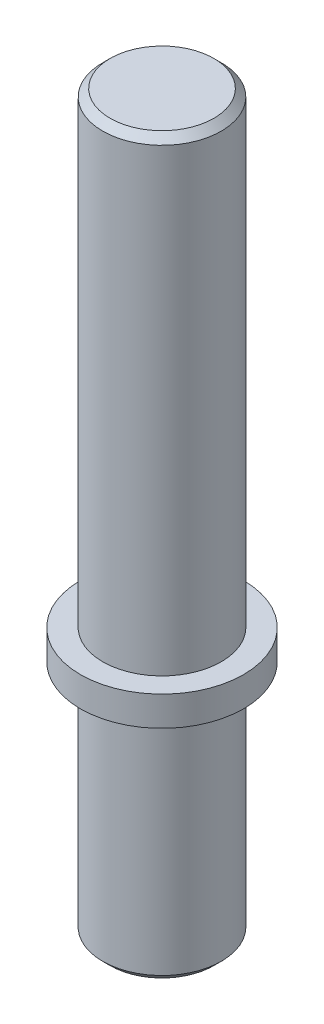
ISO-10303-21;
HEADER;
FILE_DESCRIPTION(('STEP AP214'),'2;1');
FILE_NAME('part.step','',(''),(''),'','','');
FILE_SCHEMA(('AUTOMOTIVE_DESIGN { 1 0 10303 214 1 1 1 1 }'));
ENDSEC;
DATA;
#1=APPLICATION_CONTEXT('core data for automotive mechanical design processes');
#2=APPLICATION_PROTOCOL_DEFINITION('international standard','automotive_design',2000,#1);
#3=PRODUCT_CONTEXT('',#1,'mechanical');
#4=PRODUCT('Part','Part','',(#3));
#5=PRODUCT_RELATED_PRODUCT_CATEGORY('part','',(#4));
#6=PRODUCT_DEFINITION_FORMATION('','',#4);
#7=PRODUCT_DEFINITION_CONTEXT('part definition',#1,'design');
#8=PRODUCT_DEFINITION('design','',#6,#7);
#9=PRODUCT_DEFINITION_SHAPE('','',#8);
#10=(LENGTH_UNIT() NAMED_UNIT(*) SI_UNIT(.MILLI.,.METRE.));
#11=(NAMED_UNIT(*) PLANE_ANGLE_UNIT() SI_UNIT($,.RADIAN.));
#12=(NAMED_UNIT(*) SI_UNIT($,.STERADIAN.) SOLID_ANGLE_UNIT());
#13=UNCERTAINTY_MEASURE_WITH_UNIT(LENGTH_MEASURE(1.E-05),#10,'distance_accuracy_value','');
#14=(GEOMETRIC_REPRESENTATION_CONTEXT(3) GLOBAL_UNCERTAINTY_ASSIGNED_CONTEXT((#13)) GLOBAL_UNIT_ASSIGNED_CONTEXT((#10,
#11,#12)) REPRESENTATION_CONTEXT('',''));
#15=CARTESIAN_POINT('',(0.,0.,0.));
#16=DIRECTION('',(0.,0.,1.));
#17=DIRECTION('',(1.,0.,0.));
#18=AXIS2_PLACEMENT_3D('',#15,#16,#17);
#19=CARTESIAN_POINT('',(0.,16.,0.));
#20=DIRECTION('',(0.,-1.,0.));
#21=DIRECTION('',(0.,0.,-1.));
#22=AXIS2_PLACEMENT_3D('',#19,#20,#21);
#23=CYLINDRICAL_SURFACE('',#22,4.);
#24=CARTESIAN_POINT('',(0.,0.49999999999999,0.));
#25=DIRECTION('',(0.,1.,0.));
#26=DIRECTION('',(0.,0.,1.));
#27=AXIS2_PLACEMENT_3D('',#24,#25,#26);
#28=CIRCLE('',#27,4.);
#29=CARTESIAN_POINT('',(0.,0.49999999999999,4.));
#30=VERTEX_POINT('',#29);
#31=EDGE_CURVE('E53',#30,#30,#28,.T.);
#32=ORIENTED_EDGE('',*,*,#31,.T.);
#33=EDGE_LOOP('',(#32));
#34=FACE_BOUND('',#33,.T.);
#35=CARTESIAN_POINT('',(0.,16.,0.));
#36=DIRECTION('',(0.,1.,0.));
#37=DIRECTION('',(0.,0.,1.));
#38=AXIS2_PLACEMENT_3D('',#35,#36,#37);
#39=CIRCLE('',#38,4.);
#40=CARTESIAN_POINT('',(0.,16.,4.));
#41=VERTEX_POINT('',#40);
#42=EDGE_CURVE('E59',#41,#41,#39,.T.);
#43=ORIENTED_EDGE('',*,*,#42,.F.);
#44=EDGE_LOOP('',(#43));
#45=FACE_BOUND('',#44,.T.);
#46=ADVANCED_FACE('F37',(#34,#45),#23,.T.);
#47=CARTESIAN_POINT('',(0.,0.,0.));
#48=DIRECTION('',(0.,1.,0.));
#49=DIRECTION('',(0.,0.,1.));
#50=AXIS2_PLACEMENT_3D('',#47,#48,#49);
#51=PLANE('',#50);
#52=CARTESIAN_POINT('',(0.,0.,0.));
#53=DIRECTION('',(0.,1.,0.));
#54=DIRECTION('',(0.,0.,1.));
#55=AXIS2_PLACEMENT_3D('',#52,#53,#54);
#56=CIRCLE('',#55,3.50000000000001);
#57=CARTESIAN_POINT('',(0.,0.,3.50000000000001));
#58=VERTEX_POINT('',#57);
#59=EDGE_CURVE('E49',#58,#58,#56,.F.);
#60=ORIENTED_EDGE('',*,*,#59,.T.);
#61=EDGE_LOOP('',(#60));
#62=FACE_BOUND('',#61,.T.);
#63=ADVANCED_FACE('F83',(#62),#51,.F.);
#64=CARTESIAN_POINT('',(0.,18.,0.));
#65=DIRECTION('',(0.,-1.,0.));
#66=DIRECTION('',(0.,0.,-1.));
#67=AXIS2_PLACEMENT_3D('',#64,#65,#66);
#68=CYLINDRICAL_SURFACE('',#67,5.5);
#69=CARTESIAN_POINT('',(0.,18.,0.));
#70=DIRECTION('',(0.,1.,0.));
#71=DIRECTION('',(0.,0.,1.));
#72=AXIS2_PLACEMENT_3D('',#69,#70,#71);
#73=CIRCLE('',#72,5.5);
#74=CARTESIAN_POINT('',(0.,18.,5.5));
#75=VERTEX_POINT('',#74);
#76=EDGE_CURVE('E62',#75,#75,#73,.T.);
#77=ORIENTED_EDGE('',*,*,#76,.F.);
#78=EDGE_LOOP('',(#77));
#79=FACE_BOUND('',#78,.T.);
#80=CARTESIAN_POINT('',(0.,16.,0.));
#81=DIRECTION('',(0.,1.,0.));
#82=DIRECTION('',(0.,0.,1.));
#83=AXIS2_PLACEMENT_3D('',#80,#81,#82);
#84=CIRCLE('',#83,5.5);
#85=CARTESIAN_POINT('',(0.,16.,5.5));
#86=VERTEX_POINT('',#85);
#87=EDGE_CURVE('E63',#86,#86,#84,.T.);
#88=ORIENTED_EDGE('',*,*,#87,.T.);
#89=EDGE_LOOP('',(#88));
#90=FACE_BOUND('',#89,.T.);
#91=ADVANCED_FACE('F77',(#79,#90),#68,.T.);
#92=CARTESIAN_POINT('',(0.,18.,0.));
#93=DIRECTION('',(0.,1.,0.));
#94=DIRECTION('',(0.,0.,1.));
#95=AXIS2_PLACEMENT_3D('',#92,#93,#94);
#96=PLANE('',#95);
#97=CARTESIAN_POINT('',(0.,18.,0.));
#98=DIRECTION('',(0.,1.,0.));
#99=DIRECTION('',(0.,0.,1.));
#100=AXIS2_PLACEMENT_3D('',#97,#98,#99);
#101=CIRCLE('',#100,4.);
#102=CARTESIAN_POINT('',(0.,18.,4.));
#103=VERTEX_POINT('',#102);
#104=EDGE_CURVE('E58',#103,#103,#101,.T.);
#105=ORIENTED_EDGE('',*,*,#104,.F.);
#106=EDGE_LOOP('',(#105));
#107=FACE_BOUND('',#106,.T.);
#108=ORIENTED_EDGE('',*,*,#76,.T.);
#109=EDGE_LOOP('',(#108));
#110=FACE_BOUND('',#109,.T.);
#111=ADVANCED_FACE('F73',(#107,#110),#96,.T.);
#112=CARTESIAN_POINT('',(0.,16.,0.));
#113=DIRECTION('',(0.,1.,0.));
#114=DIRECTION('',(0.,0.,1.));
#115=AXIS2_PLACEMENT_3D('',#112,#113,#114);
#116=PLANE('',#115);
#117=ORIENTED_EDGE('',*,*,#42,.T.);
#118=EDGE_LOOP('',(#117));
#119=FACE_BOUND('',#118,.T.);
#120=ORIENTED_EDGE('',*,*,#87,.F.);
#121=EDGE_LOOP('',(#120));
#122=FACE_BOUND('',#121,.T.);
#123=ADVANCED_FACE('F76',(#119,#122),#116,.F.);
#124=CARTESIAN_POINT('',(0.,49.5,0.));
#125=DIRECTION('',(0.,-1.,0.));
#126=DIRECTION('',(0.,0.,-1.));
#127=AXIS2_PLACEMENT_3D('',#124,#125,#126);
#128=CYLINDRICAL_SURFACE('',#127,4.);
#129=CARTESIAN_POINT('',(0.,49.,0.));
#130=DIRECTION('',(0.,1.,0.));
#131=DIRECTION('',(0.,0.,1.));
#132=AXIS2_PLACEMENT_3D('',#129,#130,#131);
#133=CIRCLE('',#132,4.);
#134=CARTESIAN_POINT('',(0.,49.,4.));
#135=VERTEX_POINT('',#134);
#136=EDGE_CURVE('E10',#135,#135,#133,.F.);
#137=ORIENTED_EDGE('',*,*,#136,.T.);
#138=EDGE_LOOP('',(#137));
#139=FACE_BOUND('',#138,.T.);
#140=ORIENTED_EDGE('',*,*,#104,.T.);
#141=EDGE_LOOP('',(#140));
#142=FACE_BOUND('',#141,.T.);
#143=ADVANCED_FACE('F71',(#139,#142),#128,.T.);
#144=CARTESIAN_POINT('',(0.,49.5,0.));
#145=DIRECTION('',(0.,1.,0.));
#146=DIRECTION('',(0.,0.,1.));
#147=AXIS2_PLACEMENT_3D('',#144,#145,#146);
#148=PLANE('',#147);
#149=CARTESIAN_POINT('',(0.,49.5,0.));
#150=DIRECTION('',(0.,1.,0.));
#151=DIRECTION('',(0.,0.,1.));
#152=AXIS2_PLACEMENT_3D('',#149,#150,#151);
#153=CIRCLE('',#152,3.5);
#154=CARTESIAN_POINT('',(0.,49.5,3.5));
#155=VERTEX_POINT('',#154);
#156=EDGE_CURVE('E45',#155,#155,#153,.T.);
#157=ORIENTED_EDGE('',*,*,#156,.T.);
#158=EDGE_LOOP('',(#157));
#159=FACE_BOUND('',#158,.T.);
#160=ADVANCED_FACE('F93',(#159),#148,.T.);
#161=CARTESIAN_POINT('',(0.,0.49999999999999,0.));
#162=DIRECTION('',(0.,1.,0.));
#163=DIRECTION('',(0.,0.,1.));
#164=AXIS2_PLACEMENT_3D('',#161,#162,#163);
#165=CONICAL_SURFACE('',#164,4.,0.785398163397448);
#166=ORIENTED_EDGE('',*,*,#59,.F.);
#167=EDGE_LOOP('',(#166));
#168=FACE_BOUND('',#167,.T.);
#169=ORIENTED_EDGE('',*,*,#31,.F.);
#170=EDGE_LOOP('',(#169));
#171=FACE_BOUND('',#170,.T.);
#172=ADVANCED_FACE('F105',(#168,#171),#165,.T.);
#173=CARTESIAN_POINT('',(0.,49.5,0.));
#174=DIRECTION('',(0.,-1.,0.));
#175=DIRECTION('',(0.,0.,-1.));
#176=AXIS2_PLACEMENT_3D('',#173,#174,#175);
#177=CONICAL_SURFACE('',#176,3.5,0.785398163397452);
#178=ORIENTED_EDGE('',*,*,#136,.F.);
#179=EDGE_LOOP('',(#178));
#180=FACE_BOUND('',#179,.T.);
#181=ORIENTED_EDGE('',*,*,#156,.F.);
#182=EDGE_LOOP('',(#181));
#183=FACE_BOUND('',#182,.T.);
#184=ADVANCED_FACE('F40',(#180,#183),#177,.T.);
#185=CLOSED_SHELL('',(#46,#63,#91,#111,#123,#143,#160,#172,#184));
#186=MANIFOLD_SOLID_BREP('B2',#185);
#187=ADVANCED_BREP_SHAPE_REPRESENTATION('',(#18,#186),#14);
#188=SHAPE_DEFINITION_REPRESENTATION(#9,#187);
ENDSEC;
END-ISO-10303-21;
